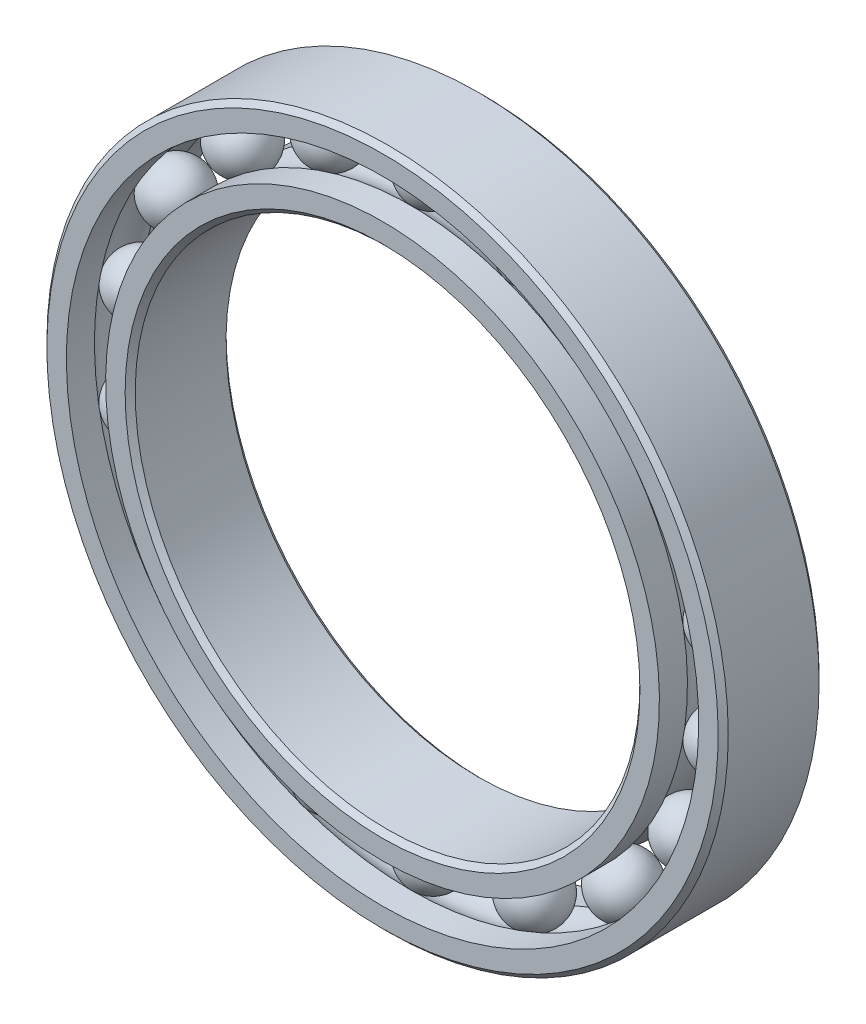
ISO-10303-21;
HEADER;
FILE_DESCRIPTION(('STEP AP214'),'2;1');
FILE_NAME('part.step','',(''),(''),'','','');
FILE_SCHEMA(('AUTOMOTIVE_DESIGN { 1 0 10303 214 1 1 1 1 }'));
ENDSEC;
DATA;
#1=APPLICATION_CONTEXT('core data for automotive mechanical design processes');
#2=APPLICATION_PROTOCOL_DEFINITION('international standard','automotive_design',2000,#1);
#3=PRODUCT_CONTEXT('',#1,'mechanical');
#4=PRODUCT('Part','Part','',(#3));
#5=PRODUCT_RELATED_PRODUCT_CATEGORY('part','',(#4));
#6=PRODUCT_DEFINITION_FORMATION('','',#4);
#7=PRODUCT_DEFINITION_CONTEXT('part definition',#1,'design');
#8=PRODUCT_DEFINITION('design','',#6,#7);
#9=PRODUCT_DEFINITION_SHAPE('','',#8);
#10=(LENGTH_UNIT() NAMED_UNIT(*) SI_UNIT(.MILLI.,.METRE.));
#11=(NAMED_UNIT(*) PLANE_ANGLE_UNIT() SI_UNIT($,.RADIAN.));
#12=(NAMED_UNIT(*) SI_UNIT($,.STERADIAN.) SOLID_ANGLE_UNIT());
#13=UNCERTAINTY_MEASURE_WITH_UNIT(LENGTH_MEASURE(1.E-05),#10,'distance_accuracy_value','');
#14=(GEOMETRIC_REPRESENTATION_CONTEXT(3) GLOBAL_UNCERTAINTY_ASSIGNED_CONTEXT((#13)) GLOBAL_UNIT_ASSIGNED_CONTEXT((#10,
#11,#12)) REPRESENTATION_CONTEXT('',''));
#15=CARTESIAN_POINT('',(0.,0.,0.));
#16=DIRECTION('',(0.,0.,1.));
#17=DIRECTION('',(1.,0.,0.));
#18=AXIS2_PLACEMENT_3D('',#15,#16,#17);
#19=CARTESIAN_POINT('',(4.01873668407647,11.0413882942345,0.));
#20=DIRECTION('',(0.,0.,1.));
#21=DIRECTION('',(0.342020143325657,0.939692620785913,0.));
#22=AXIS2_PLACEMENT_3D('',#19,#20,#21);
#23=SPHERICAL_SURFACE('',#22,1.18112731252607);
#24=CARTESIAN_POINT('',(4.01873668407647,11.0413882942345,1.18112731252606));
#25=VERTEX_POINT('',#24);
#26=VERTEX_LOOP('',#25);
#27=FACE_BOUND('',#26,.T.);
#28=ADVANCED_FACE('F42',(#27),#23,.T.);
#29=CLOSED_SHELL('',(#28));
#30=MANIFOLD_SOLID_BREP('B2',#29);
#31=CARTESIAN_POINT('',(7.55275441381673,9.00102220664809,0.));
#32=DIRECTION('',(0.,0.,1.));
#33=DIRECTION('',(0.64278760968653,0.766044443118986,0.));
#34=AXIS2_PLACEMENT_3D('',#31,#32,#33);
#35=SPHERICAL_SURFACE('',#34,1.18112731252607);
#36=CARTESIAN_POINT('',(7.55275441381673,9.00102220664809,1.18112731252606));
#37=VERTEX_POINT('',#36);
#38=VERTEX_LOOP('',#37);
#39=FACE_BOUND('',#38,.T.);
#40=ADVANCED_FACE('F59',(#39),#35,.T.);
#41=CLOSED_SHELL('',(#40));
#42=MANIFOLD_SOLID_BREP('B6',#41);
#43=CARTESIAN_POINT('',(10.1757984944671,5.87500000000012,0.));
#44=DIRECTION('',(0.,0.,1.));
#45=DIRECTION('',(0.866025403784433,0.50000000000001,0.));
#46=AXIS2_PLACEMENT_3D('',#43,#44,#45);
#47=SPHERICAL_SURFACE('',#46,1.18112731252607);
#48=CARTESIAN_POINT('',(10.1757984944671,5.87500000000012,1.18112731252606));
#49=VERTEX_POINT('',#48);
#50=VERTEX_LOOP('',#49);
#51=FACE_BOUND('',#50,.T.);
#52=ADVANCED_FACE('F76',(#51),#47,.T.);
#53=CLOSED_SHELL('',(#52));
#54=MANIFOLD_SOLID_BREP('B38',#53);
#55=CARTESIAN_POINT('',(11.5714910978934,2.04036608758655,0.));
#56=DIRECTION('',(0.,0.,1.));
#57=DIRECTION('',(0.984807753012206,0.17364817766694,0.));
#58=AXIS2_PLACEMENT_3D('',#55,#56,#57);
#59=SPHERICAL_SURFACE('',#58,1.18112731252607);
#60=CARTESIAN_POINT('',(11.5714910978934,2.04036608758655,1.18112731252606));
#61=VERTEX_POINT('',#60);
#62=VERTEX_LOOP('',#61);
#63=FACE_BOUND('',#62,.T.);
#64=ADVANCED_FACE('F93',(#63),#59,.T.);
#65=CLOSED_SHELL('',(#64));
#66=MANIFOLD_SOLID_BREP('B55',#65);
#67=CARTESIAN_POINT('',(11.5714910978935,-2.04036608758632,0.));
#68=DIRECTION('',(0.,0.,1.));
#69=DIRECTION('',(0.98480775301221,-0.173648177666921,0.));
#70=AXIS2_PLACEMENT_3D('',#67,#68,#69);
#71=SPHERICAL_SURFACE('',#70,1.18112731252607);
#72=CARTESIAN_POINT('',(11.5714910978935,-2.04036608758632,1.18112731252606));
#73=VERTEX_POINT('',#72);
#74=VERTEX_LOOP('',#73);
#75=FACE_BOUND('',#74,.T.);
#76=ADVANCED_FACE('F110',(#75),#71,.T.);
#77=CLOSED_SHELL('',(#76));
#78=MANIFOLD_SOLID_BREP('B72',#77);
#79=CARTESIAN_POINT('',(10.1757984944672,-5.87499999999991,0.));
#80=DIRECTION('',(0.,0.,1.));
#81=DIRECTION('',(0.866025403784443,-0.499999999999992,0.));
#82=AXIS2_PLACEMENT_3D('',#79,#80,#81);
#83=SPHERICAL_SURFACE('',#82,1.18112731252607);
#84=CARTESIAN_POINT('',(10.1757984944672,-5.87499999999991,1.18112731252606));
#85=VERTEX_POINT('',#84);
#86=VERTEX_LOOP('',#85);
#87=FACE_BOUND('',#86,.T.);
#88=ADVANCED_FACE('F127',(#87),#83,.T.);
#89=CLOSED_SHELL('',(#88));
#90=MANIFOLD_SOLID_BREP('B89',#89);
#91=CARTESIAN_POINT('',(7.55275441381691,-9.00102220664793,0.));
#92=DIRECTION('',(0.,0.,1.));
#93=DIRECTION('',(0.642787609686546,-0.766044443118973,0.));
#94=AXIS2_PLACEMENT_3D('',#91,#92,#93);
#95=SPHERICAL_SURFACE('',#94,1.18112731252607);
#96=CARTESIAN_POINT('',(7.55275441381691,-9.00102220664793,1.18112731252606));
#97=VERTEX_POINT('',#96);
#98=VERTEX_LOOP('',#97);
#99=FACE_BOUND('',#98,.T.);
#100=ADVANCED_FACE('F144',(#99),#95,.T.);
#101=CLOSED_SHELL('',(#100));
#102=MANIFOLD_SOLID_BREP('B106',#101);
#103=CARTESIAN_POINT('',(4.01873668407669,-11.0413882942344,0.));
#104=DIRECTION('',(0.,0.,1.));
#105=DIRECTION('',(0.342020143325676,-0.939692620785906,0.));
#106=AXIS2_PLACEMENT_3D('',#103,#104,#105);
#107=SPHERICAL_SURFACE('',#106,1.18112731252607);
#108=CARTESIAN_POINT('',(4.01873668407669,-11.0413882942344,1.18112731252606));
#109=VERTEX_POINT('',#108);
#110=VERTEX_LOOP('',#109);
#111=FACE_BOUND('',#110,.T.);
#112=ADVANCED_FACE('F161',(#111),#107,.T.);
#113=CLOSED_SHELL('',(#112));
#114=MANIFOLD_SOLID_BREP('B123',#113);
#115=CARTESIAN_POINT('',(0.,-11.75,0.));
#116=DIRECTION('',(0.,0.,1.));
#117=DIRECTION('',(0.,-1.,0.));
#118=AXIS2_PLACEMENT_3D('',#115,#116,#117);
#119=SPHERICAL_SURFACE('',#118,1.18112731252607);
#120=CARTESIAN_POINT('',(0.,-11.75,1.18112731252606));
#121=VERTEX_POINT('',#120);
#122=VERTEX_LOOP('',#121);
#123=FACE_BOUND('',#122,.T.);
#124=ADVANCED_FACE('F178',(#123),#119,.T.);
#125=CLOSED_SHELL('',(#124));
#126=MANIFOLD_SOLID_BREP('B140',#125);
#127=CARTESIAN_POINT('',(-4.01873668407654,-11.0413882942345,0.));
#128=DIRECTION('',(0.,0.,1.));
#129=DIRECTION('',(-0.342020143325663,-0.939692620785911,0.));
#130=AXIS2_PLACEMENT_3D('',#127,#128,#129);
#131=SPHERICAL_SURFACE('',#130,1.18112731252607);
#132=CARTESIAN_POINT('',(-4.01873668407654,-11.0413882942345,1.18112731252606));
#133=VERTEX_POINT('',#132);
#134=VERTEX_LOOP('',#133);
#135=FACE_BOUND('',#134,.T.);
#136=ADVANCED_FACE('F195',(#135),#131,.T.);
#137=CLOSED_SHELL('',(#136));
#138=MANIFOLD_SOLID_BREP('B157',#137);
#139=CARTESIAN_POINT('',(-7.55275441381679,-9.00102220664803,0.));
#140=DIRECTION('',(0.,0.,1.));
#141=DIRECTION('',(-0.642787609686535,-0.766044443118981,0.));
#142=AXIS2_PLACEMENT_3D('',#139,#140,#141);
#143=SPHERICAL_SURFACE('',#142,1.18112731252607);
#144=CARTESIAN_POINT('',(-7.55275441381679,-9.00102220664803,1.18112731252606));
#145=VERTEX_POINT('',#144);
#146=VERTEX_LOOP('',#145);
#147=FACE_BOUND('',#146,.T.);
#148=ADVANCED_FACE('F212',(#147),#143,.T.);
#149=CLOSED_SHELL('',(#148));
#150=MANIFOLD_SOLID_BREP('B174',#149);
#151=CARTESIAN_POINT('',(-10.1757984944671,-5.87500000000005,0.));
#152=DIRECTION('',(0.,0.,1.));
#153=DIRECTION('',(-0.866025403784436,-0.500000000000004,0.));
#154=AXIS2_PLACEMENT_3D('',#151,#152,#153);
#155=SPHERICAL_SURFACE('',#154,1.18112731252607);
#156=CARTESIAN_POINT('',(-10.1757984944671,-5.87500000000005,1.18112731252606));
#157=VERTEX_POINT('',#156);
#158=VERTEX_LOOP('',#157);
#159=FACE_BOUND('',#158,.T.);
#160=ADVANCED_FACE('F229',(#159),#155,.T.);
#161=CLOSED_SHELL('',(#160));
#162=MANIFOLD_SOLID_BREP('B191',#161);
#163=CARTESIAN_POINT('',(-11.5714910978934,-2.04036608758648,0.));
#164=DIRECTION('',(0.,0.,1.));
#165=DIRECTION('',(-0.984807753012207,-0.173648177666934,0.));
#166=AXIS2_PLACEMENT_3D('',#163,#164,#165);
#167=SPHERICAL_SURFACE('',#166,1.18112731252607);
#168=CARTESIAN_POINT('',(-11.5714910978934,-2.04036608758648,1.18112731252606));
#169=VERTEX_POINT('',#168);
#170=VERTEX_LOOP('',#169);
#171=FACE_BOUND('',#170,.T.);
#172=ADVANCED_FACE('F246',(#171),#167,.T.);
#173=CLOSED_SHELL('',(#172));
#174=MANIFOLD_SOLID_BREP('B208',#173);
#175=CARTESIAN_POINT('',(-11.5714910978935,2.0403660875864,0.));
#176=DIRECTION('',(0.,0.,1.));
#177=DIRECTION('',(-0.984807753012209,0.173648177666927,0.));
#178=AXIS2_PLACEMENT_3D('',#175,#176,#177);
#179=SPHERICAL_SURFACE('',#178,1.18112731252607);
#180=CARTESIAN_POINT('',(-11.5714910978935,2.0403660875864,1.18112731252606));
#181=VERTEX_POINT('',#180);
#182=VERTEX_LOOP('',#181);
#183=FACE_BOUND('',#182,.T.);
#184=ADVANCED_FACE('F263',(#183),#179,.T.);
#185=CLOSED_SHELL('',(#184));
#186=MANIFOLD_SOLID_BREP('B225',#185);
#187=CARTESIAN_POINT('',(-10.1757984944672,5.87499999999998,0.));
#188=DIRECTION('',(0.,0.,1.));
#189=DIRECTION('',(-0.86602540378444,0.499999999999998,0.));
#190=AXIS2_PLACEMENT_3D('',#187,#188,#189);
#191=SPHERICAL_SURFACE('',#190,1.18112731252607);
#192=CARTESIAN_POINT('',(-10.1757984944672,5.87499999999998,1.18112731252606));
#193=VERTEX_POINT('',#192);
#194=VERTEX_LOOP('',#193);
#195=FACE_BOUND('',#194,.T.);
#196=ADVANCED_FACE('F280',(#195),#191,.T.);
#197=CLOSED_SHELL('',(#196));
#198=MANIFOLD_SOLID_BREP('B242',#197);
#199=CARTESIAN_POINT('',(-7.55275441381685,9.00102220664799,0.));
#200=DIRECTION('',(0.,0.,1.));
#201=DIRECTION('',(-0.642787609686541,0.766044443118977,0.));
#202=AXIS2_PLACEMENT_3D('',#199,#200,#201);
#203=SPHERICAL_SURFACE('',#202,1.18112731252607);
#204=CARTESIAN_POINT('',(-7.55275441381685,9.00102220664799,1.18112731252606));
#205=VERTEX_POINT('',#204);
#206=VERTEX_LOOP('',#205);
#207=FACE_BOUND('',#206,.T.);
#208=ADVANCED_FACE('F297',(#207),#203,.T.);
#209=CLOSED_SHELL('',(#208));
#210=MANIFOLD_SOLID_BREP('B259',#209);
#211=CARTESIAN_POINT('',(-4.01873668407662,11.0413882942344,0.));
#212=DIRECTION('',(0.,0.,1.));
#213=DIRECTION('',(-0.342020143325669,0.939692620785908,0.));
#214=AXIS2_PLACEMENT_3D('',#211,#212,#213);
#215=SPHERICAL_SURFACE('',#214,1.18112731252607);
#216=CARTESIAN_POINT('',(-4.01873668407662,11.0413882942344,1.18112731252606));
#217=VERTEX_POINT('',#216);
#218=VERTEX_LOOP('',#217);
#219=FACE_BOUND('',#218,.T.);
#220=ADVANCED_FACE('F314',(#219),#215,.T.);
#221=CLOSED_SHELL('',(#220));
#222=MANIFOLD_SOLID_BREP('B276',#221);
#223=CARTESIAN_POINT('',(0.,11.75,0.));
#224=DIRECTION('',(0.,0.,1.));
#225=DIRECTION('',(0.,1.,0.));
#226=AXIS2_PLACEMENT_3D('',#223,#224,#225);
#227=SPHERICAL_SURFACE('',#226,1.18112731252607);
#228=CARTESIAN_POINT('',(0.,11.75,1.18112731252606));
#229=VERTEX_POINT('',#228);
#230=VERTEX_LOOP('',#229);
#231=FACE_BOUND('',#230,.T.);
#232=ADVANCED_FACE('F333',(#231),#227,.T.);
#233=CLOSED_SHELL('',(#232));
#234=MANIFOLD_SOLID_BREP('B293',#233);
#235=CARTESIAN_POINT('',(0.,10.9722222222222,2.));
#236=DIRECTION('',(0.,0.,-1.));
#237=DIRECTION('',(0.,1.,0.));
#238=AXIS2_PLACEMENT_3D('',#235,#236,#237);
#239=PLANE('',#238);
#240=CARTESIAN_POINT('',(0.,0.,2.));
#241=DIRECTION('',(0.,0.,1.));
#242=DIRECTION('',(0.,-1.,0.));
#243=AXIS2_PLACEMENT_3D('',#240,#241,#242);
#244=CIRCLE('',#243,10.2);
#245=CARTESIAN_POINT('',(0.,-10.2,2.));
#246=VERTEX_POINT('',#245);
#247=EDGE_CURVE('E379',#246,#246,#244,.T.);
#248=ORIENTED_EDGE('',*,*,#247,.F.);
#249=EDGE_LOOP('',(#248));
#250=FACE_BOUND('',#249,.T.);
#251=CARTESIAN_POINT('',(0.,0.,2.));
#252=DIRECTION('',(0.,0.,1.));
#253=DIRECTION('',(0.,-1.,0.));
#254=AXIS2_PLACEMENT_3D('',#251,#252,#253);
#255=CIRCLE('',#254,10.9722222222222);
#256=CARTESIAN_POINT('',(0.,-10.9722222222222,2.));
#257=VERTEX_POINT('',#256);
#258=EDGE_CURVE('E332',#257,#257,#255,.T.);
#259=ORIENTED_EDGE('',*,*,#258,.T.);
#260=EDGE_LOOP('',(#259));
#261=FACE_BOUND('',#260,.T.);
#262=ADVANCED_FACE('F351',(#250,#261),#239,.F.);
#263=CARTESIAN_POINT('',(0.,0.,1.99999999999999));
#264=DIRECTION('',(0.,0.,1.));
#265=DIRECTION('',(0.,-1.,0.));
#266=AXIS2_PLACEMENT_3D('',#263,#264,#265);
#267=CYLINDRICAL_SURFACE('',#266,10.9722222222222);
#268=ORIENTED_EDGE('',*,*,#258,.F.);
#269=EDGE_LOOP('',(#268));
#270=FACE_BOUND('',#269,.T.);
#271=CARTESIAN_POINT('',(0.,0.,0.888888888888882));
#272=DIRECTION('',(0.,0.,1.));
#273=DIRECTION('',(0.,-1.,0.));
#274=AXIS2_PLACEMENT_3D('',#271,#272,#273);
#275=CIRCLE('',#274,10.9722222222222);
#276=CARTESIAN_POINT('',(0.,-10.9722222222222,0.888888888888881));
#277=VERTEX_POINT('',#276);
#278=EDGE_CURVE('E357',#277,#277,#275,.T.);
#279=ORIENTED_EDGE('',*,*,#278,.T.);
#280=EDGE_LOOP('',(#279));
#281=FACE_BOUND('',#280,.T.);
#282=ADVANCED_FACE('F386',(#270,#281),#267,.T.);
#283=CARTESIAN_POINT('',(0.,0.,0.));
#284=DIRECTION('',(0.,0.,1.));
#285=DIRECTION('',(0.,-1.,0.));
#286=AXIS2_PLACEMENT_3D('',#283,#284,#285);
#287=TOROIDAL_SURFACE('',#286,11.75,1.18112731252607);
#288=ORIENTED_EDGE('',*,*,#278,.F.);
#289=EDGE_LOOP('',(#288));
#290=FACE_BOUND('',#289,.T.);
#291=CARTESIAN_POINT('',(0.,0.,-0.888888888888885));
#292=DIRECTION('',(0.,0.,1.));
#293=DIRECTION('',(0.,-1.,0.));
#294=AXIS2_PLACEMENT_3D('',#291,#292,#293);
#295=CIRCLE('',#294,10.9722222222222);
#296=CARTESIAN_POINT('',(0.,-10.9722222222222,-0.888888888888886));
#297=VERTEX_POINT('',#296);
#298=EDGE_CURVE('E361',#297,#297,#295,.T.);
#299=ORIENTED_EDGE('',*,*,#298,.T.);
#300=EDGE_LOOP('',(#299));
#301=FACE_BOUND('',#300,.T.);
#302=ADVANCED_FACE('F390',(#290,#301),#287,.F.);
#303=CARTESIAN_POINT('',(0.,0.,1.99999999999999));
#304=DIRECTION('',(0.,0.,1.));
#305=DIRECTION('',(0.,-1.,0.));
#306=AXIS2_PLACEMENT_3D('',#303,#304,#305);
#307=CYLINDRICAL_SURFACE('',#306,10.9722222222222);
#308=ORIENTED_EDGE('',*,*,#298,.F.);
#309=EDGE_LOOP('',(#308));
#310=FACE_BOUND('',#309,.T.);
#311=CARTESIAN_POINT('',(0.,0.,-2.00000000000001));
#312=DIRECTION('',(0.,0.,1.));
#313=DIRECTION('',(0.,-1.,0.));
#314=AXIS2_PLACEMENT_3D('',#311,#312,#313);
#315=CIRCLE('',#314,10.9722222222222);
#316=CARTESIAN_POINT('',(0.,-10.9722222222222,-2.00000000000001));
#317=VERTEX_POINT('',#316);
#318=EDGE_CURVE('E365',#317,#317,#315,.T.);
#319=ORIENTED_EDGE('',*,*,#318,.T.);
#320=EDGE_LOOP('',(#319));
#321=FACE_BOUND('',#320,.T.);
#322=ADVANCED_FACE('F395',(#310,#321),#307,.T.);
#323=CARTESIAN_POINT('',(0.,10.2,-2.00000000000001));
#324=DIRECTION('',(0.,0.,1.));
#325=DIRECTION('',(0.,-1.,0.));
#326=AXIS2_PLACEMENT_3D('',#323,#324,#325);
#327=PLANE('',#326);
#328=ORIENTED_EDGE('',*,*,#318,.F.);
#329=EDGE_LOOP('',(#328));
#330=FACE_BOUND('',#329,.T.);
#331=CARTESIAN_POINT('',(0.,0.,-2.00000000000001));
#332=DIRECTION('',(0.,0.,1.));
#333=DIRECTION('',(0.,-1.,0.));
#334=AXIS2_PLACEMENT_3D('',#331,#332,#333);
#335=CIRCLE('',#334,10.2);
#336=CARTESIAN_POINT('',(0.,-10.2,-2.00000000000001));
#337=VERTEX_POINT('',#336);
#338=EDGE_CURVE('E370',#337,#337,#335,.T.);
#339=ORIENTED_EDGE('',*,*,#338,.T.);
#340=EDGE_LOOP('',(#339));
#341=FACE_BOUND('',#340,.T.);
#342=ADVANCED_FACE('F401',(#330,#341),#327,.F.);
#343=CARTESIAN_POINT('',(0.,0.,-1.80000000000001));
#344=DIRECTION('',(0.,0.,-1.));
#345=DIRECTION('',(0.,1.,0.));
#346=AXIS2_PLACEMENT_3D('',#343,#344,#345);
#347=CONICAL_SURFACE('',#346,10.,0.785398163397432);
#348=ORIENTED_EDGE('',*,*,#338,.F.);
#349=EDGE_LOOP('',(#348));
#350=FACE_BOUND('',#349,.T.);
#351=CARTESIAN_POINT('',(0.,0.,-1.80000000000001));
#352=DIRECTION('',(0.,0.,1.));
#353=DIRECTION('',(0.,-1.,0.));
#354=AXIS2_PLACEMENT_3D('',#351,#352,#353);
#355=CIRCLE('',#354,10.);
#356=CARTESIAN_POINT('',(0.,-10.,-1.80000000000001));
#357=VERTEX_POINT('',#356);
#358=EDGE_CURVE('E373',#357,#357,#355,.T.);
#359=ORIENTED_EDGE('',*,*,#358,.T.);
#360=EDGE_LOOP('',(#359));
#361=FACE_BOUND('',#360,.T.);
#362=ADVANCED_FACE('F405',(#350,#361),#347,.F.);
#363=CARTESIAN_POINT('',(0.,0.,1.99999999999999));
#364=DIRECTION('',(0.,0.,1.));
#365=DIRECTION('',(0.,-1.,0.));
#366=AXIS2_PLACEMENT_3D('',#363,#364,#365);
#367=CYLINDRICAL_SURFACE('',#366,10.);
#368=ORIENTED_EDGE('',*,*,#358,.F.);
#369=EDGE_LOOP('',(#368));
#370=FACE_BOUND('',#369,.T.);
#371=CARTESIAN_POINT('',(0.,0.,1.80000000000001));
#372=DIRECTION('',(0.,0.,1.));
#373=DIRECTION('',(0.,-1.,0.));
#374=AXIS2_PLACEMENT_3D('',#371,#372,#373);
#375=CIRCLE('',#374,10.);
#376=CARTESIAN_POINT('',(0.,-10.,1.80000000000001));
#377=VERTEX_POINT('',#376);
#378=EDGE_CURVE('E376',#377,#377,#375,.T.);
#379=ORIENTED_EDGE('',*,*,#378,.T.);
#380=EDGE_LOOP('',(#379));
#381=FACE_BOUND('',#380,.T.);
#382=ADVANCED_FACE('F409',(#370,#381),#367,.F.);
#383=CARTESIAN_POINT('',(0.,0.,2.));
#384=DIRECTION('',(0.,0.,1.));
#385=DIRECTION('',(0.,-1.,0.));
#386=AXIS2_PLACEMENT_3D('',#383,#384,#385);
#387=CONICAL_SURFACE('',#386,10.2,0.785398163397463);
#388=ORIENTED_EDGE('',*,*,#378,.F.);
#389=EDGE_LOOP('',(#388));
#390=FACE_BOUND('',#389,.T.);
#391=ORIENTED_EDGE('',*,*,#247,.T.);
#392=EDGE_LOOP('',(#391));
#393=FACE_BOUND('',#392,.T.);
#394=ADVANCED_FACE('F383',(#390,#393),#387,.F.);
#395=CLOSED_SHELL('',(#262,#282,#302,#322,#342,#362,#382,#394));
#396=MANIFOLD_SOLID_BREP('B310',#395);
#397=CARTESIAN_POINT('',(0.,0.,1.99999999999999));
#398=DIRECTION('',(0.,0.,1.));
#399=DIRECTION('',(0.,-1.,0.));
#400=AXIS2_PLACEMENT_3D('',#397,#398,#399);
#401=CYLINDRICAL_SURFACE('',#400,13.5);
#402=CARTESIAN_POINT('',(0.,0.,1.8));
#403=DIRECTION('',(0.,0.,1.));
#404=DIRECTION('',(0.,-1.,0.));
#405=AXIS2_PLACEMENT_3D('',#402,#403,#404);
#406=CIRCLE('',#405,13.5);
#407=CARTESIAN_POINT('',(0.,-13.5,1.8));
#408=VERTEX_POINT('',#407);
#409=EDGE_CURVE('E350',#408,#408,#406,.T.);
#410=ORIENTED_EDGE('',*,*,#409,.F.);
#411=EDGE_LOOP('',(#410));
#412=FACE_BOUND('',#411,.T.);
#413=CARTESIAN_POINT('',(0.,0.,-1.80000000000001));
#414=DIRECTION('',(0.,0.,1.));
#415=DIRECTION('',(0.,-1.,0.));
#416=AXIS2_PLACEMENT_3D('',#413,#414,#415);
#417=CIRCLE('',#416,13.5);
#418=CARTESIAN_POINT('',(0.,-13.5,-1.80000000000001));
#419=VERTEX_POINT('',#418);
#420=EDGE_CURVE('E485',#419,#419,#417,.T.);
#421=ORIENTED_EDGE('',*,*,#420,.T.);
#422=EDGE_LOOP('',(#421));
#423=FACE_BOUND('',#422,.T.);
#424=ADVANCED_FACE('F457',(#412,#423),#401,.T.);
#425=CARTESIAN_POINT('',(0.,0.,1.8));
#426=DIRECTION('',(0.,0.,-1.));
#427=DIRECTION('',(0.,1.,0.));
#428=AXIS2_PLACEMENT_3D('',#425,#426,#427);
#429=CONICAL_SURFACE('',#428,13.5,0.785398163397457);
#430=CARTESIAN_POINT('',(0.,0.,1.99999999999999));
#431=DIRECTION('',(0.,0.,1.));
#432=DIRECTION('',(0.,-1.,0.));
#433=AXIS2_PLACEMENT_3D('',#430,#431,#432);
#434=CIRCLE('',#433,13.3);
#435=CARTESIAN_POINT('',(0.,-13.3,1.99999999999999));
#436=VERTEX_POINT('',#435);
#437=EDGE_CURVE('E463',#436,#436,#434,.T.);
#438=ORIENTED_EDGE('',*,*,#437,.F.);
#439=EDGE_LOOP('',(#438));
#440=FACE_BOUND('',#439,.T.);
#441=ORIENTED_EDGE('',*,*,#409,.T.);
#442=EDGE_LOOP('',(#441));
#443=FACE_BOUND('',#442,.T.);
#444=ADVANCED_FACE('F522',(#440,#443),#429,.T.);
#445=CARTESIAN_POINT('',(0.,13.3,1.99999999999999));
#446=DIRECTION('',(0.,0.,-1.));
#447=DIRECTION('',(0.,1.,0.));
#448=AXIS2_PLACEMENT_3D('',#445,#446,#447);
#449=PLANE('',#448);
#450=CARTESIAN_POINT('',(0.,0.,1.99999999999999));
#451=DIRECTION('',(0.,0.,1.));
#452=DIRECTION('',(0.,-1.,0.));
#453=AXIS2_PLACEMENT_3D('',#450,#451,#452);
#454=CIRCLE('',#453,12.5277777777778);
#455=CARTESIAN_POINT('',(0.,-12.5277777777778,1.99999999999999));
#456=VERTEX_POINT('',#455);
#457=EDGE_CURVE('E467',#456,#456,#454,.T.);
#458=ORIENTED_EDGE('',*,*,#457,.F.);
#459=EDGE_LOOP('',(#458));
#460=FACE_BOUND('',#459,.T.);
#461=ORIENTED_EDGE('',*,*,#437,.T.);
#462=EDGE_LOOP('',(#461));
#463=FACE_BOUND('',#462,.T.);
#464=ADVANCED_FACE('F517',(#460,#463),#449,.F.);
#465=CARTESIAN_POINT('',(0.,0.,1.99999999999999));
#466=DIRECTION('',(0.,0.,1.));
#467=DIRECTION('',(0.,-1.,0.));
#468=AXIS2_PLACEMENT_3D('',#465,#466,#467);
#469=CYLINDRICAL_SURFACE('',#468,12.5277777777778);
#470=CARTESIAN_POINT('',(0.,0.,0.888888888888882));
#471=DIRECTION('',(0.,0.,1.));
#472=DIRECTION('',(0.,-1.,0.));
#473=AXIS2_PLACEMENT_3D('',#470,#471,#472);
#474=CIRCLE('',#473,12.5277777777778);
#475=CARTESIAN_POINT('',(0.,-12.5277777777778,0.88888888888888));
#476=VERTEX_POINT('',#475);
#477=EDGE_CURVE('E471',#476,#476,#474,.T.);
#478=ORIENTED_EDGE('',*,*,#477,.F.);
#479=EDGE_LOOP('',(#478));
#480=FACE_BOUND('',#479,.T.);
#481=ORIENTED_EDGE('',*,*,#457,.T.);
#482=EDGE_LOOP('',(#481));
#483=FACE_BOUND('',#482,.T.);
#484=ADVANCED_FACE('F511',(#480,#483),#469,.F.);
#485=CARTESIAN_POINT('',(0.,0.,0.));
#486=DIRECTION('',(0.,0.,1.));
#487=DIRECTION('',(0.,-1.,0.));
#488=AXIS2_PLACEMENT_3D('',#485,#486,#487);
#489=TOROIDAL_SURFACE('',#488,11.75,1.18112731252607);
#490=CARTESIAN_POINT('',(0.,0.,-0.888888888888897));
#491=DIRECTION('',(0.,0.,1.));
#492=DIRECTION('',(0.,-1.,0.));
#493=AXIS2_PLACEMENT_3D('',#490,#491,#492);
#494=CIRCLE('',#493,12.5277777777778);
#495=CARTESIAN_POINT('',(0.,-12.5277777777778,-0.888888888888898));
#496=VERTEX_POINT('',#495);
#497=EDGE_CURVE('E476',#496,#496,#494,.T.);
#498=ORIENTED_EDGE('',*,*,#497,.F.);
#499=EDGE_LOOP('',(#498));
#500=FACE_BOUND('',#499,.T.);
#501=ORIENTED_EDGE('',*,*,#477,.T.);
#502=EDGE_LOOP('',(#501));
#503=FACE_BOUND('',#502,.T.);
#504=ADVANCED_FACE('F505',(#500,#503),#489,.F.);
#505=CARTESIAN_POINT('',(0.,0.,1.99999999999999));
#506=DIRECTION('',(0.,0.,1.));
#507=DIRECTION('',(0.,-1.,0.));
#508=AXIS2_PLACEMENT_3D('',#505,#506,#507);
#509=CYLINDRICAL_SURFACE('',#508,12.5277777777778);
#510=CARTESIAN_POINT('',(0.,0.,-2.00000000000001));
#511=DIRECTION('',(0.,0.,1.));
#512=DIRECTION('',(0.,-1.,0.));
#513=AXIS2_PLACEMENT_3D('',#510,#511,#512);
#514=CIRCLE('',#513,12.5277777777778);
#515=CARTESIAN_POINT('',(0.,-12.5277777777778,-2.00000000000001));
#516=VERTEX_POINT('',#515);
#517=EDGE_CURVE('E479',#516,#516,#514,.T.);
#518=ORIENTED_EDGE('',*,*,#517,.F.);
#519=EDGE_LOOP('',(#518));
#520=FACE_BOUND('',#519,.T.);
#521=ORIENTED_EDGE('',*,*,#497,.T.);
#522=EDGE_LOOP('',(#521));
#523=FACE_BOUND('',#522,.T.);
#524=ADVANCED_FACE('F499',(#520,#523),#509,.F.);
#525=CARTESIAN_POINT('',(0.,13.3,-2.00000000000001));
#526=DIRECTION('',(0.,0.,1.));
#527=DIRECTION('',(0.,-1.,0.));
#528=AXIS2_PLACEMENT_3D('',#525,#526,#527);
#529=PLANE('',#528);
#530=CARTESIAN_POINT('',(0.,0.,-2.00000000000001));
#531=DIRECTION('',(0.,0.,1.));
#532=DIRECTION('',(0.,-1.,0.));
#533=AXIS2_PLACEMENT_3D('',#530,#531,#532);
#534=CIRCLE('',#533,13.3);
#535=CARTESIAN_POINT('',(0.,-13.3,-2.00000000000001));
#536=VERTEX_POINT('',#535);
#537=EDGE_CURVE('E482',#536,#536,#534,.T.);
#538=ORIENTED_EDGE('',*,*,#537,.F.);
#539=EDGE_LOOP('',(#538));
#540=FACE_BOUND('',#539,.T.);
#541=ORIENTED_EDGE('',*,*,#517,.T.);
#542=EDGE_LOOP('',(#541));
#543=FACE_BOUND('',#542,.T.);
#544=ADVANCED_FACE('F493',(#540,#543),#529,.F.);
#545=CARTESIAN_POINT('',(0.,0.,-2.00000000000001));
#546=DIRECTION('',(0.,0.,1.));
#547=DIRECTION('',(0.,-1.,0.));
#548=AXIS2_PLACEMENT_3D('',#545,#546,#547);
#549=CONICAL_SURFACE('',#548,13.3,0.785398163397457);
#550=ORIENTED_EDGE('',*,*,#420,.F.);
#551=EDGE_LOOP('',(#550));
#552=FACE_BOUND('',#551,.T.);
#553=ORIENTED_EDGE('',*,*,#537,.T.);
#554=EDGE_LOOP('',(#553));
#555=FACE_BOUND('',#554,.T.);
#556=ADVANCED_FACE('F490',(#552,#555),#549,.T.);
#557=CLOSED_SHELL('',(#424,#444,#464,#484,#504,#524,#544,#556));
#558=MANIFOLD_SOLID_BREP('B327',#557);
#559=ADVANCED_BREP_SHAPE_REPRESENTATION('',(#18,#30,#42,#54,#66,#78,#90,#102,#114,#126,#138,
#150,#162,#174,#186,#198,#210,#222,#234,#396,#558),#14);
#560=SHAPE_DEFINITION_REPRESENTATION(#9,#559);
ENDSEC;
END-ISO-10303-21;
